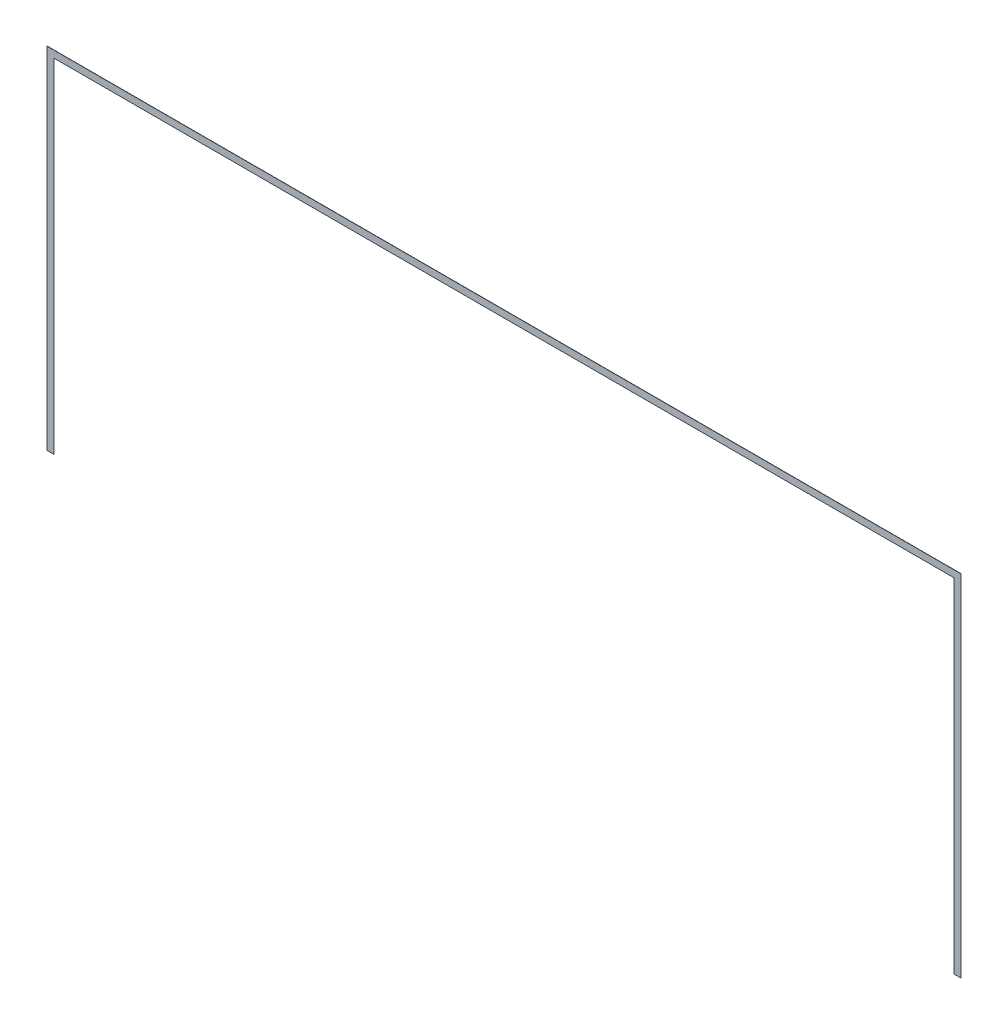
ISO-10303-21;
HEADER;
FILE_DESCRIPTION(('STEP AP214'),'2;1');
FILE_NAME('part.step','',(''),(''),'','','');
FILE_SCHEMA(('AUTOMOTIVE_DESIGN { 1 0 10303 214 1 1 1 1 }'));
ENDSEC;
DATA;
#1=APPLICATION_CONTEXT('core data for automotive mechanical design processes');
#2=APPLICATION_PROTOCOL_DEFINITION('international standard','automotive_design',2000,#1);
#3=PRODUCT_CONTEXT('',#1,'mechanical');
#4=PRODUCT('Part','Part','',(#3));
#5=PRODUCT_RELATED_PRODUCT_CATEGORY('part','',(#4));
#6=PRODUCT_DEFINITION_FORMATION('','',#4);
#7=PRODUCT_DEFINITION_CONTEXT('part definition',#1,'design');
#8=PRODUCT_DEFINITION('design','',#6,#7);
#9=PRODUCT_DEFINITION_SHAPE('','',#8);
#10=(LENGTH_UNIT() NAMED_UNIT(*) SI_UNIT(.MILLI.,.METRE.));
#11=(NAMED_UNIT(*) PLANE_ANGLE_UNIT() SI_UNIT($,.RADIAN.));
#12=(NAMED_UNIT(*) SI_UNIT($,.STERADIAN.) SOLID_ANGLE_UNIT());
#13=UNCERTAINTY_MEASURE_WITH_UNIT(LENGTH_MEASURE(1.E-05),#10,'distance_accuracy_value','');
#14=(GEOMETRIC_REPRESENTATION_CONTEXT(3) GLOBAL_UNCERTAINTY_ASSIGNED_CONTEXT((#13)) GLOBAL_UNIT_ASSIGNED_CONTEXT((#10,
#11,#12)) REPRESENTATION_CONTEXT('',''));
#15=CARTESIAN_POINT('',(0.,0.,0.));
#16=DIRECTION('',(0.,0.,1.));
#17=DIRECTION('',(1.,0.,0.));
#18=AXIS2_PLACEMENT_3D('',#15,#16,#17);
#19=CARTESIAN_POINT('',(-960.950136184692,7020.97074050902,1.5875));
#20=DIRECTION('',(0.,0.,1.));
#21=DIRECTION('',(1.,0.,0.));
#22=AXIS2_PLACEMENT_3D('',#19,#20,#21);
#23=PLANE('',#22);
#24=DIRECTION('',(0.,1.,0.));
#25=VECTOR('',#24,1.);
#26=CARTESIAN_POINT('',(2336.28736381531,6995.57074050902,1.5875));
#27=LINE('',#26,#25);
#28=CARTESIAN_POINT('',(2336.28736381531,5738.27074050902,1.5875));
#29=VERTEX_POINT('',#28);
#30=CARTESIAN_POINT('',(2336.2873638153,8252.87074050902,1.5875));
#31=VERTEX_POINT('',#30);
#32=EDGE_CURVE('E110',#29,#31,#27,.T.);
#33=ORIENTED_EDGE('',*,*,#32,.F.);
#34=DIRECTION('',(1.,0.,0.));
#35=VECTOR('',#34,1.);
#36=CARTESIAN_POINT('',(2361.68736381531,5738.27074050902,1.5875));
#37=LINE('',#36,#35);
#38=CARTESIAN_POINT('',(2387.08736381531,5738.27074050902,1.5875));
#39=VERTEX_POINT('',#38);
#40=EDGE_CURVE('E114',#39,#29,#37,.F.);
#41=ORIENTED_EDGE('',*,*,#40,.F.);
#42=DIRECTION('',(0.,1.,0.));
#43=VECTOR('',#42,1.);
#44=CARTESIAN_POINT('',(2387.08736381531,7020.97074050902,1.5875));
#45=LINE('',#44,#43);
#46=CARTESIAN_POINT('',(2387.08736381531,8303.67074050902,1.5875));
#47=VERTEX_POINT('',#46);
#48=EDGE_CURVE('E118',#47,#39,#45,.F.);
#49=ORIENTED_EDGE('',*,*,#48,.F.);
#50=DIRECTION('',(1.,0.,0.));
#51=VECTOR('',#50,1.);
#52=CARTESIAN_POINT('',(-960.950136184692,8303.67074050902,1.5875));
#53=LINE('',#52,#51);
#54=CARTESIAN_POINT('',(-4308.98763618471,8303.67074050902,1.5875));
#55=VERTEX_POINT('',#54);
#56=EDGE_CURVE('E95',#55,#47,#53,.T.);
#57=ORIENTED_EDGE('',*,*,#56,.F.);
#58=DIRECTION('',(0.,1.,0.));
#59=VECTOR('',#58,1.);
#60=CARTESIAN_POINT('',(-4308.98763618471,7020.97074050902,1.5875));
#61=LINE('',#60,#59);
#62=CARTESIAN_POINT('',(-4308.98763618471,5738.27074050902,1.5875));
#63=VERTEX_POINT('',#62);
#64=EDGE_CURVE('E20',#63,#55,#61,.T.);
#65=ORIENTED_EDGE('',*,*,#64,.F.);
#66=DIRECTION('',(1.,0.,0.));
#67=VECTOR('',#66,1.);
#68=CARTESIAN_POINT('',(-4283.58763618471,5738.27074050902,1.5875));
#69=LINE('',#68,#67);
#70=CARTESIAN_POINT('',(-4258.18763618471,5738.27074050902,1.5875));
#71=VERTEX_POINT('',#70);
#72=EDGE_CURVE('E83',#71,#63,#69,.F.);
#73=ORIENTED_EDGE('',*,*,#72,.F.);
#74=DIRECTION('',(0.,1.,0.));
#75=VECTOR('',#74,1.);
#76=CARTESIAN_POINT('',(-4258.18763618471,6995.57074050902,1.5875));
#77=LINE('',#76,#75);
#78=CARTESIAN_POINT('',(-4258.18763618471,8252.87074050902,1.5875));
#79=VERTEX_POINT('',#78);
#80=EDGE_CURVE('E78',#79,#71,#77,.F.);
#81=ORIENTED_EDGE('',*,*,#80,.F.);
#82=DIRECTION('',(1.,0.,0.));
#83=VECTOR('',#82,1.);
#84=CARTESIAN_POINT('',(-960.950136184692,8252.87074050902,1.5875));
#85=LINE('',#84,#83);
#86=EDGE_CURVE('E106',#31,#79,#85,.F.);
#87=ORIENTED_EDGE('',*,*,#86,.F.);
#88=EDGE_LOOP('',(#33,#41,#49,#57,#65,#73,#81,#87));
#89=FACE_BOUND('',#88,.T.);
#90=ADVANCED_FACE('F17',(#89),#23,.T.);
#91=CARTESIAN_POINT('',(-4308.98763618471,7020.97074050902,6.35));
#92=DIRECTION('',(-1.,0.,0.));
#93=DIRECTION('',(0.,0.,1.));
#94=AXIS2_PLACEMENT_3D('',#91,#92,#93);
#95=PLANE('',#94);
#96=DIRECTION('',(0.,1.,0.));
#97=VECTOR('',#96,1.);
#98=CARTESIAN_POINT('',(-4308.98763618471,7020.97074050902,0.));
#99=LINE('',#98,#97);
#100=CARTESIAN_POINT('',(-4308.98763618471,8303.67074050902,0.));
#101=VERTEX_POINT('',#100);
#102=CARTESIAN_POINT('',(-4308.98763618471,5738.27074050902,0.));
#103=VERTEX_POINT('',#102);
#104=EDGE_CURVE('E101',#101,#103,#99,.F.);
#105=ORIENTED_EDGE('',*,*,#104,.T.);
#106=DIRECTION('',(0.,0.,-1.));
#107=VECTOR('',#106,1.);
#108=CARTESIAN_POINT('',(-4308.98763618471,5738.27074050902,6.35));
#109=LINE('',#108,#107);
#110=EDGE_CURVE('E88',#63,#103,#109,.T.);
#111=ORIENTED_EDGE('',*,*,#110,.F.);
#112=ORIENTED_EDGE('',*,*,#64,.T.);
#113=DIRECTION('',(0.,0.,1.));
#114=VECTOR('',#113,1.);
#115=CARTESIAN_POINT('',(-4308.98763618471,8303.67074050902,6.35));
#116=LINE('',#115,#114);
#117=EDGE_CURVE('E124',#101,#55,#116,.T.);
#118=ORIENTED_EDGE('',*,*,#117,.F.);
#119=EDGE_LOOP('',(#105,#111,#112,#118));
#120=FACE_BOUND('',#119,.T.);
#121=ADVANCED_FACE('F100',(#120),#95,.T.);
#122=CARTESIAN_POINT('',(-4283.58763618471,5738.27074050902,6.35));
#123=DIRECTION('',(0.,-1.,0.));
#124=DIRECTION('',(0.,0.,-1.));
#125=AXIS2_PLACEMENT_3D('',#122,#123,#124);
#126=PLANE('',#125);
#127=DIRECTION('',(1.,0.,0.));
#128=VECTOR('',#127,1.);
#129=CARTESIAN_POINT('',(-960.950136184692,5738.27074050902,0.));
#130=LINE('',#129,#128);
#131=CARTESIAN_POINT('',(-4258.18763618471,5738.27074050902,0.));
#132=VERTEX_POINT('',#131);
#133=EDGE_CURVE('E127',#103,#132,#130,.T.);
#134=ORIENTED_EDGE('',*,*,#133,.T.);
#135=DIRECTION('',(0.,0.,-1.));
#136=VECTOR('',#135,1.);
#137=CARTESIAN_POINT('',(-4258.18763618471,5738.27074050902,6.35));
#138=LINE('',#137,#136);
#139=EDGE_CURVE('E90',#71,#132,#138,.T.);
#140=ORIENTED_EDGE('',*,*,#139,.F.);
#141=ORIENTED_EDGE('',*,*,#72,.T.);
#142=ORIENTED_EDGE('',*,*,#110,.T.);
#143=EDGE_LOOP('',(#134,#140,#141,#142));
#144=FACE_BOUND('',#143,.T.);
#145=ADVANCED_FACE('F86',(#144),#126,.T.);
#146=CARTESIAN_POINT('',(-4258.18763618471,6995.57074050902,6.35));
#147=DIRECTION('',(1.,0.,0.));
#148=DIRECTION('',(0.,0.,-1.));
#149=AXIS2_PLACEMENT_3D('',#146,#147,#148);
#150=PLANE('',#149);
#151=DIRECTION('',(0.,1.,0.));
#152=VECTOR('',#151,1.);
#153=CARTESIAN_POINT('',(-4258.18763618471,7020.97074050902,0.));
#154=LINE('',#153,#152);
#155=CARTESIAN_POINT('',(-4258.18763618471,8252.87074050902,0.));
#156=VERTEX_POINT('',#155);
#157=EDGE_CURVE('E129',#132,#156,#154,.T.);
#158=ORIENTED_EDGE('',*,*,#157,.T.);
#159=DIRECTION('',(0.,0.,-1.));
#160=VECTOR('',#159,1.);
#161=CARTESIAN_POINT('',(-4258.18763618471,8252.87074050902,6.35));
#162=LINE('',#161,#160);
#163=EDGE_CURVE('E108',#79,#156,#162,.T.);
#164=ORIENTED_EDGE('',*,*,#163,.F.);
#165=ORIENTED_EDGE('',*,*,#80,.T.);
#166=ORIENTED_EDGE('',*,*,#139,.T.);
#167=EDGE_LOOP('',(#158,#164,#165,#166));
#168=FACE_BOUND('',#167,.T.);
#169=ADVANCED_FACE('F162',(#168),#150,.T.);
#170=CARTESIAN_POINT('',(-960.950136184692,8252.87074050902,6.35));
#171=DIRECTION('',(0.,-1.,0.));
#172=DIRECTION('',(0.,0.,-1.));
#173=AXIS2_PLACEMENT_3D('',#170,#171,#172);
#174=PLANE('',#173);
#175=DIRECTION('',(1.,0.,0.));
#176=VECTOR('',#175,1.);
#177=CARTESIAN_POINT('',(-960.950136184692,8252.87074050902,0.));
#178=LINE('',#177,#176);
#179=CARTESIAN_POINT('',(2336.2873638153,8252.87074050902,0.));
#180=VERTEX_POINT('',#179);
#181=EDGE_CURVE('E132',#156,#180,#178,.T.);
#182=ORIENTED_EDGE('',*,*,#181,.T.);
#183=DIRECTION('',(0.,0.,1.));
#184=VECTOR('',#183,1.);
#185=CARTESIAN_POINT('',(2336.28736381531,8252.87074050902,6.35));
#186=LINE('',#185,#184);
#187=EDGE_CURVE('E112',#31,#180,#186,.F.);
#188=ORIENTED_EDGE('',*,*,#187,.F.);
#189=ORIENTED_EDGE('',*,*,#86,.T.);
#190=ORIENTED_EDGE('',*,*,#163,.T.);
#191=EDGE_LOOP('',(#182,#188,#189,#190));
#192=FACE_BOUND('',#191,.T.);
#193=ADVANCED_FACE('F161',(#192),#174,.T.);
#194=CARTESIAN_POINT('',(2336.28736381531,6995.57074050902,6.35));
#195=DIRECTION('',(-1.,0.,0.));
#196=DIRECTION('',(0.,0.,1.));
#197=AXIS2_PLACEMENT_3D('',#194,#195,#196);
#198=PLANE('',#197);
#199=DIRECTION('',(0.,1.,0.));
#200=VECTOR('',#199,1.);
#201=CARTESIAN_POINT('',(2336.2873638153,7020.97074050902,0.));
#202=LINE('',#201,#200);
#203=CARTESIAN_POINT('',(2336.28736381531,5738.27074050902,0.));
#204=VERTEX_POINT('',#203);
#205=EDGE_CURVE('E135',#180,#204,#202,.F.);
#206=ORIENTED_EDGE('',*,*,#205,.T.);
#207=DIRECTION('',(0.,0.,-1.));
#208=VECTOR('',#207,1.);
#209=CARTESIAN_POINT('',(2336.28736381531,5738.27074050902,6.35));
#210=LINE('',#209,#208);
#211=EDGE_CURVE('E116',#29,#204,#210,.T.);
#212=ORIENTED_EDGE('',*,*,#211,.F.);
#213=ORIENTED_EDGE('',*,*,#32,.T.);
#214=ORIENTED_EDGE('',*,*,#187,.T.);
#215=EDGE_LOOP('',(#206,#212,#213,#214));
#216=FACE_BOUND('',#215,.T.);
#217=ADVANCED_FACE('F155',(#216),#198,.T.);
#218=CARTESIAN_POINT('',(2361.68736381531,5738.27074050902,6.35));
#219=DIRECTION('',(0.,-1.,0.));
#220=DIRECTION('',(0.,0.,-1.));
#221=AXIS2_PLACEMENT_3D('',#218,#219,#220);
#222=PLANE('',#221);
#223=DIRECTION('',(1.,0.,0.));
#224=VECTOR('',#223,1.);
#225=CARTESIAN_POINT('',(-960.950136184692,5738.27074050902,0.));
#226=LINE('',#225,#224);
#227=CARTESIAN_POINT('',(2387.08736381531,5738.27074050902,0.));
#228=VERTEX_POINT('',#227);
#229=EDGE_CURVE('E138',#204,#228,#226,.T.);
#230=ORIENTED_EDGE('',*,*,#229,.T.);
#231=DIRECTION('',(0.,0.,-1.));
#232=VECTOR('',#231,1.);
#233=CARTESIAN_POINT('',(2387.08736381531,5738.27074050902,6.35));
#234=LINE('',#233,#232);
#235=EDGE_CURVE('E120',#39,#228,#234,.T.);
#236=ORIENTED_EDGE('',*,*,#235,.F.);
#237=ORIENTED_EDGE('',*,*,#40,.T.);
#238=ORIENTED_EDGE('',*,*,#211,.T.);
#239=EDGE_LOOP('',(#230,#236,#237,#238));
#240=FACE_BOUND('',#239,.T.);
#241=ADVANCED_FACE('F151',(#240),#222,.T.);
#242=CARTESIAN_POINT('',(2387.08736381531,7020.97074050902,6.35));
#243=DIRECTION('',(1.,0.,0.));
#244=DIRECTION('',(0.,0.,-1.));
#245=AXIS2_PLACEMENT_3D('',#242,#243,#244);
#246=PLANE('',#245);
#247=DIRECTION('',(0.,1.,0.));
#248=VECTOR('',#247,1.);
#249=CARTESIAN_POINT('',(2387.08736381531,7020.97074050902,0.));
#250=LINE('',#249,#248);
#251=CARTESIAN_POINT('',(2387.08736381531,8303.67074050902,0.));
#252=VERTEX_POINT('',#251);
#253=EDGE_CURVE('E26',#228,#252,#250,.T.);
#254=ORIENTED_EDGE('',*,*,#253,.T.);
#255=DIRECTION('',(0.,0.,1.));
#256=VECTOR('',#255,1.);
#257=CARTESIAN_POINT('',(2387.08736381531,8303.67074050902,6.35));
#258=LINE('',#257,#256);
#259=EDGE_CURVE('E34',#47,#252,#258,.F.);
#260=ORIENTED_EDGE('',*,*,#259,.F.);
#261=ORIENTED_EDGE('',*,*,#48,.T.);
#262=ORIENTED_EDGE('',*,*,#235,.T.);
#263=EDGE_LOOP('',(#254,#260,#261,#262));
#264=FACE_BOUND('',#263,.T.);
#265=ADVANCED_FACE('F144',(#264),#246,.T.);
#266=CARTESIAN_POINT('',(-960.950136184692,8303.67074050902,6.35));
#267=DIRECTION('',(0.,1.,0.));
#268=DIRECTION('',(0.,0.,1.));
#269=AXIS2_PLACEMENT_3D('',#266,#267,#268);
#270=PLANE('',#269);
#271=DIRECTION('',(1.,0.,0.));
#272=VECTOR('',#271,1.);
#273=CARTESIAN_POINT('',(-960.950136184692,8303.67074050902,0.));
#274=LINE('',#273,#272);
#275=EDGE_CURVE('E11',#252,#101,#274,.F.);
#276=ORIENTED_EDGE('',*,*,#275,.T.);
#277=ORIENTED_EDGE('',*,*,#117,.T.);
#278=ORIENTED_EDGE('',*,*,#56,.T.);
#279=ORIENTED_EDGE('',*,*,#259,.T.);
#280=EDGE_LOOP('',(#276,#277,#278,#279));
#281=FACE_BOUND('',#280,.T.);
#282=ADVANCED_FACE('F163',(#281),#270,.T.);
#283=CARTESIAN_POINT('',(-960.950136184692,7020.97074050902,0.));
#284=DIRECTION('',(0.,0.,1.));
#285=DIRECTION('',(1.,0.,0.));
#286=AXIS2_PLACEMENT_3D('',#283,#284,#285);
#287=PLANE('',#286);
#288=ORIENTED_EDGE('',*,*,#253,.F.);
#289=ORIENTED_EDGE('',*,*,#229,.F.);
#290=ORIENTED_EDGE('',*,*,#205,.F.);
#291=ORIENTED_EDGE('',*,*,#181,.F.);
#292=ORIENTED_EDGE('',*,*,#157,.F.);
#293=ORIENTED_EDGE('',*,*,#133,.F.);
#294=ORIENTED_EDGE('',*,*,#104,.F.);
#295=ORIENTED_EDGE('',*,*,#275,.F.);
#296=EDGE_LOOP('',(#288,#289,#290,#291,#292,#293,#294,#295));
#297=FACE_BOUND('',#296,.T.);
#298=ADVANCED_FACE('F148',(#297),#287,.F.);
#299=CLOSED_SHELL('',(#90,#121,#145,#169,#193,#217,#241,#265,#282,#298));
#300=MANIFOLD_SOLID_BREP('B1',#299);
#301=ADVANCED_BREP_SHAPE_REPRESENTATION('',(#18,#300),#14);
#302=SHAPE_DEFINITION_REPRESENTATION(#9,#301);
ENDSEC;
END-ISO-10303-21;
